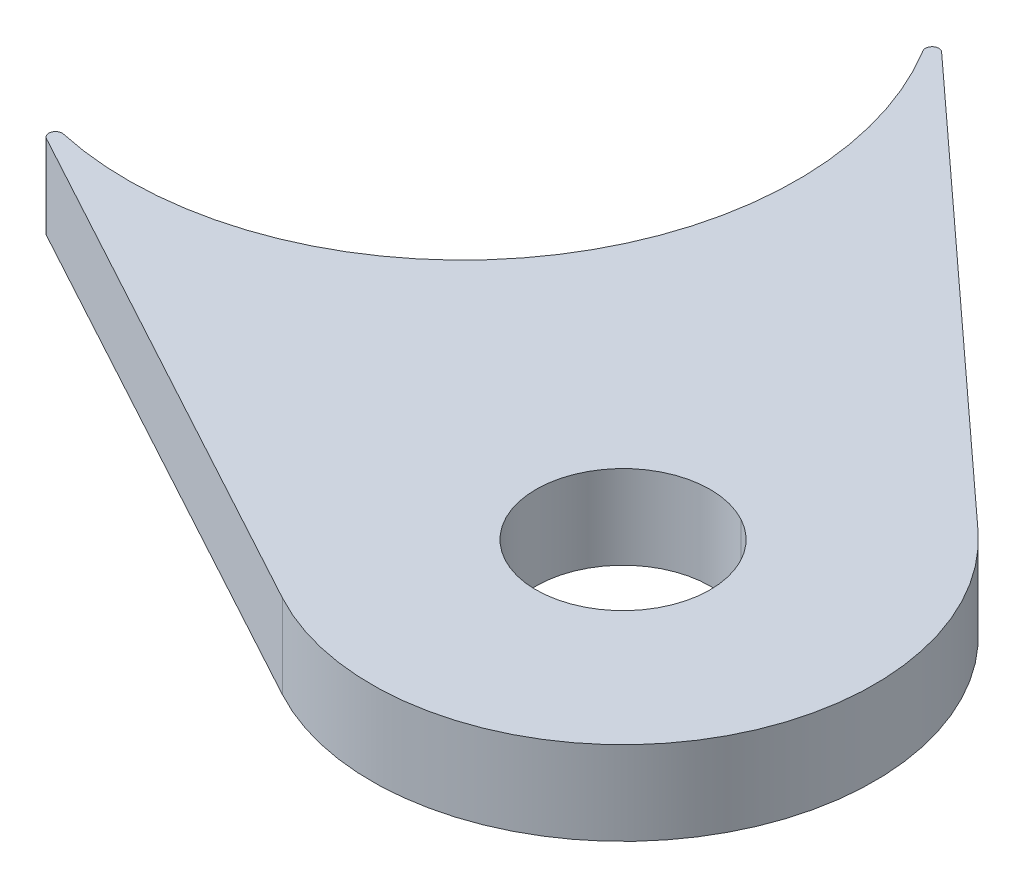
ISO-10303-21;
HEADER;
FILE_DESCRIPTION(('STEP AP214'),'2;1');
FILE_NAME('part.step','',(''),(''),'','','');
FILE_SCHEMA(('AUTOMOTIVE_DESIGN { 1 0 10303 214 1 1 1 1 }'));
ENDSEC;
DATA;
#1=APPLICATION_CONTEXT('core data for automotive mechanical design processes');
#2=APPLICATION_PROTOCOL_DEFINITION('international standard','automotive_design',2000,#1);
#3=PRODUCT_CONTEXT('',#1,'mechanical');
#4=PRODUCT('Part','Part','',(#3));
#5=PRODUCT_RELATED_PRODUCT_CATEGORY('part','',(#4));
#6=PRODUCT_DEFINITION_FORMATION('','',#4);
#7=PRODUCT_DEFINITION_CONTEXT('part definition',#1,'design');
#8=PRODUCT_DEFINITION('design','',#6,#7);
#9=PRODUCT_DEFINITION_SHAPE('','',#8);
#10=(LENGTH_UNIT() NAMED_UNIT(*) SI_UNIT(.MILLI.,.METRE.));
#11=(NAMED_UNIT(*) PLANE_ANGLE_UNIT() SI_UNIT($,.RADIAN.));
#12=(NAMED_UNIT(*) SI_UNIT($,.STERADIAN.) SOLID_ANGLE_UNIT());
#13=UNCERTAINTY_MEASURE_WITH_UNIT(LENGTH_MEASURE(1.E-05),#10,'distance_accuracy_value','');
#14=(GEOMETRIC_REPRESENTATION_CONTEXT(3) GLOBAL_UNCERTAINTY_ASSIGNED_CONTEXT((#13)) GLOBAL_UNIT_ASSIGNED_CONTEXT((#10,
#11,#12)) REPRESENTATION_CONTEXT('',''));
#15=CARTESIAN_POINT('',(0.,0.,0.));
#16=DIRECTION('',(0.,0.,1.));
#17=DIRECTION('',(1.,0.,0.));
#18=AXIS2_PLACEMENT_3D('',#15,#16,#17);
#19=CARTESIAN_POINT('',(21.2002725978992,3.175,15.1119048029944));
#20=DIRECTION('',(0.,-1.,0.));
#21=DIRECTION('',(0.,0.,-1.));
#22=AXIS2_PLACEMENT_3D('',#19,#20,#21);
#23=CYLINDRICAL_SURFACE('',#22,3.29999999999998);
#24=CARTESIAN_POINT('',(21.2002725978992,3.175,15.1119048029944));
#25=DIRECTION('',(0.,1.,0.));
#26=DIRECTION('',(0.,0.,1.));
#27=AXIS2_PLACEMENT_3D('',#24,#25,#26);
#28=CIRCLE('',#27,3.29999999999998);
#29=CARTESIAN_POINT('',(22.7737409759033,3.175,12.2111812271566));
#30=VERTEX_POINT('',#29);
#31=CARTESIAN_POINT('',(19.6268042198951,3.175,18.0126283788321));
#32=VERTEX_POINT('',#31);
#33=EDGE_CURVE('E156',#30,#32,#28,.T.);
#34=ORIENTED_EDGE('',*,*,#33,.T.);
#35=DIRECTION('',(0.,-1.,0.));
#36=VECTOR('',#35,1.);
#37=CARTESIAN_POINT('',(19.6268042198951,3.175,18.0126283788321));
#38=LINE('',#37,#36);
#39=CARTESIAN_POINT('',(19.6268042198951,0.,18.0126283788321));
#40=VERTEX_POINT('',#39);
#41=EDGE_CURVE('E11',#32,#40,#38,.T.);
#42=ORIENTED_EDGE('',*,*,#41,.T.);
#43=CARTESIAN_POINT('',(21.2002725978992,0.,15.1119048029944));
#44=DIRECTION('',(0.,1.,0.));
#45=DIRECTION('',(0.,0.,1.));
#46=AXIS2_PLACEMENT_3D('',#43,#44,#45);
#47=CIRCLE('',#46,3.29999999999998);
#48=CARTESIAN_POINT('',(22.7737409759033,0.,12.2111812271566));
#49=VERTEX_POINT('',#48);
#50=EDGE_CURVE('E158',#49,#40,#47,.T.);
#51=ORIENTED_EDGE('',*,*,#50,.F.);
#52=DIRECTION('',(0.,1.,0.));
#53=VECTOR('',#52,1.);
#54=CARTESIAN_POINT('',(22.7737409759033,3.175,12.2111812271566));
#55=LINE('',#54,#53);
#56=EDGE_CURVE('E48',#49,#30,#55,.T.);
#57=ORIENTED_EDGE('',*,*,#56,.T.);
#58=EDGE_LOOP('',(#34,#42,#51,#57));
#59=FACE_BOUND('',#58,.T.);
#60=ADVANCED_FACE('F39',(#59),#23,.F.);
#61=CARTESIAN_POINT('',(21.2002725978992,3.175,15.1119048029944));
#62=DIRECTION('',(0.,-1.,0.));
#63=DIRECTION('',(0.,0.,-1.));
#64=AXIS2_PLACEMENT_3D('',#61,#62,#63);
#65=PLANE('',#64);
#66=DIRECTION('',(-0.737435012841057,0.,-0.675418094098841));
#67=VECTOR('',#66,1.);
#68=CARTESIAN_POINT('',(27.6336299441907,3.175,8.0878363056833));
#69=LINE('',#68,#67);
#70=CARTESIAN_POINT('',(27.6336299441907,3.175,8.0878363056833));
#71=VERTEX_POINT('',#70);
#72=CARTESIAN_POINT('',(11.2267519102379,3.175,-6.93925367355661));
#73=VERTEX_POINT('',#72);
#74=EDGE_CURVE('E102',#71,#73,#69,.T.);
#75=ORIENTED_EDGE('',*,*,#74,.T.);
#76=CARTESIAN_POINT('',(11.0551957143368,3.175,-6.75194518029498));
#77=DIRECTION('',(0.,-1.,0.));
#78=DIRECTION('',(0.,0.,-1.));
#79=AXIS2_PLACEMENT_3D('',#76,#77,#78);
#80=CIRCLE('',#79,0.254);
#81=CARTESIAN_POINT('',(10.8384271709185,3.175,-6.61955409832841));
#82=VERTEX_POINT('',#81);
#83=EDGE_CURVE('E146',#73,#82,#80,.F.);
#84=ORIENTED_EDGE('',*,*,#83,.T.);
#85=CARTESIAN_POINT('',(0.,3.175,0.));
#86=DIRECTION('',(0.,-1.,0.));
#87=DIRECTION('',(0.,0.,1.));
#88=AXIS2_PLACEMENT_3D('',#85,#86,#87);
#89=CIRCLE('',#88,12.7);
#90=CARTESIAN_POINT('',(-2.72242756199068,3.175,12.4047727979884));
#91=VERTEX_POINT('',#90);
#92=EDGE_CURVE('E113',#82,#91,#89,.T.);
#93=ORIENTED_EDGE('',*,*,#92,.T.);
#94=CARTESIAN_POINT('',(-2.7768761132305,3.175,12.6528682539482));
#95=DIRECTION('',(0.,-1.,0.));
#96=DIRECTION('',(0.,0.,-1.));
#97=AXIS2_PLACEMENT_3D('',#94,#95,#96);
#98=CIRCLE('',#97,0.254);
#99=CARTESIAN_POINT('',(-2.89798549747688,3.175,12.8761360685733));
#100=VERTEX_POINT('',#99);
#101=EDGE_CURVE('E144',#91,#100,#98,.F.);
#102=ORIENTED_EDGE('',*,*,#101,.T.);
#103=DIRECTION('',(0.879007144193264,0.,0.47680859939519));
#104=VECTOR('',#103,1.);
#105=CARTESIAN_POINT('',(16.65867068866,3.175,23.4844478514352));
#106=LINE('',#105,#104);
#107=CARTESIAN_POINT('',(16.65867068866,3.175,23.4844478514352));
#108=VERTEX_POINT('',#107);
#109=EDGE_CURVE('E120',#100,#108,#106,.T.);
#110=ORIENTED_EDGE('',*,*,#109,.T.);
#111=CARTESIAN_POINT('',(21.2002725978992,3.175,15.1119048029944));
#112=DIRECTION('',(0.,1.,0.));
#113=DIRECTION('',(0.,0.,-1.));
#114=AXIS2_PLACEMENT_3D('',#111,#112,#113);
#115=CIRCLE('',#114,9.525);
#116=EDGE_CURVE('E114',#108,#71,#115,.T.);
#117=ORIENTED_EDGE('',*,*,#116,.T.);
#118=EDGE_LOOP('',(#75,#84,#93,#102,#110,#117));
#119=FACE_BOUND('',#118,.T.);
#120=ORIENTED_EDGE('',*,*,#33,.F.);
#121=EDGE_CURVE('E159',#32,#30,#28,.T.);
#122=ORIENTED_EDGE('',*,*,#121,.F.);
#123=EDGE_LOOP('',(#120,#122));
#124=FACE_BOUND('',#123,.T.);
#125=ADVANCED_FACE('F117',(#119,#124),#65,.F.);
#126=CARTESIAN_POINT('',(21.2002725978992,0.,15.1119048029944));
#127=DIRECTION('',(0.,-1.,0.));
#128=DIRECTION('',(0.,0.,-1.));
#129=AXIS2_PLACEMENT_3D('',#126,#127,#128);
#130=PLANE('',#129);
#131=CARTESIAN_POINT('',(0.,0.,0.));
#132=DIRECTION('',(0.,-1.,0.));
#133=DIRECTION('',(0.,0.,1.));
#134=AXIS2_PLACEMENT_3D('',#131,#132,#133);
#135=CIRCLE('',#134,12.7);
#136=CARTESIAN_POINT('',(10.8384271709185,0.,-6.61955409832841));
#137=VERTEX_POINT('',#136);
#138=CARTESIAN_POINT('',(-2.72242756199068,0.,12.4047727979884));
#139=VERTEX_POINT('',#138);
#140=EDGE_CURVE('E170',#137,#139,#135,.T.);
#141=ORIENTED_EDGE('',*,*,#140,.F.);
#142=CARTESIAN_POINT('',(11.0551957143368,0.,-6.75194518029498));
#143=DIRECTION('',(0.,-1.,0.));
#144=DIRECTION('',(0.,0.,-1.));
#145=AXIS2_PLACEMENT_3D('',#142,#143,#144);
#146=CIRCLE('',#145,0.254);
#147=CARTESIAN_POINT('',(11.2267519102379,0.,-6.93925367355661));
#148=VERTEX_POINT('',#147);
#149=EDGE_CURVE('E141',#137,#148,#146,.T.);
#150=ORIENTED_EDGE('',*,*,#149,.T.);
#151=DIRECTION('',(-0.737435012841057,0.,-0.675418094098841));
#152=VECTOR('',#151,1.);
#153=CARTESIAN_POINT('',(27.6336299441907,0.,8.0878363056833));
#154=LINE('',#153,#152);
#155=CARTESIAN_POINT('',(27.6336299441907,0.,8.0878363056833));
#156=VERTEX_POINT('',#155);
#157=EDGE_CURVE('E161',#156,#148,#154,.T.);
#158=ORIENTED_EDGE('',*,*,#157,.F.);
#159=CARTESIAN_POINT('',(21.2002725978992,0.,15.1119048029944));
#160=DIRECTION('',(0.,1.,0.));
#161=DIRECTION('',(0.,0.,-1.));
#162=AXIS2_PLACEMENT_3D('',#159,#160,#161);
#163=CIRCLE('',#162,9.525);
#164=CARTESIAN_POINT('',(16.65867068866,0.,23.4844478514352));
#165=VERTEX_POINT('',#164);
#166=EDGE_CURVE('E128',#165,#156,#163,.T.);
#167=ORIENTED_EDGE('',*,*,#166,.F.);
#168=DIRECTION('',(0.879007144193264,0.,0.47680859939519));
#169=VECTOR('',#168,1.);
#170=CARTESIAN_POINT('',(16.65867068866,0.,23.4844478514352));
#171=LINE('',#170,#169);
#172=CARTESIAN_POINT('',(-2.89798549747688,0.,12.8761360685733));
#173=VERTEX_POINT('',#172);
#174=EDGE_CURVE('E124',#173,#165,#171,.T.);
#175=ORIENTED_EDGE('',*,*,#174,.F.);
#176=CARTESIAN_POINT('',(-2.7768761132305,0.,12.6528682539482));
#177=DIRECTION('',(0.,-1.,0.));
#178=DIRECTION('',(0.,0.,-1.));
#179=AXIS2_PLACEMENT_3D('',#176,#177,#178);
#180=CIRCLE('',#179,0.254);
#181=EDGE_CURVE('E139',#173,#139,#180,.T.);
#182=ORIENTED_EDGE('',*,*,#181,.T.);
#183=EDGE_LOOP('',(#141,#150,#158,#167,#175,#182));
#184=FACE_BOUND('',#183,.T.);
#185=ORIENTED_EDGE('',*,*,#50,.T.);
#186=EDGE_CURVE('E164',#40,#49,#47,.T.);
#187=ORIENTED_EDGE('',*,*,#186,.T.);
#188=EDGE_LOOP('',(#185,#187));
#189=FACE_BOUND('',#188,.T.);
#190=ADVANCED_FACE('F178',(#184,#189),#130,.T.);
#191=CARTESIAN_POINT('',(21.2002725978992,3.175,15.1119048029944));
#192=DIRECTION('',(0.,-1.,0.));
#193=DIRECTION('',(0.,0.,-1.));
#194=AXIS2_PLACEMENT_3D('',#191,#192,#193);
#195=CYLINDRICAL_SURFACE('',#194,9.525);
#196=ORIENTED_EDGE('',*,*,#166,.T.);
#197=DIRECTION('',(0.,-1.,0.));
#198=VECTOR('',#197,1.);
#199=CARTESIAN_POINT('',(27.6336299441907,3.175,8.0878363056833));
#200=LINE('',#199,#198);
#201=EDGE_CURVE('E107',#71,#156,#200,.T.);
#202=ORIENTED_EDGE('',*,*,#201,.F.);
#203=ORIENTED_EDGE('',*,*,#116,.F.);
#204=DIRECTION('',(0.,-1.,0.));
#205=VECTOR('',#204,1.);
#206=CARTESIAN_POINT('',(16.65867068866,3.175,23.4844478514352));
#207=LINE('',#206,#205);
#208=EDGE_CURVE('E130',#108,#165,#207,.T.);
#209=ORIENTED_EDGE('',*,*,#208,.T.);
#210=EDGE_LOOP('',(#196,#202,#203,#209));
#211=FACE_BOUND('',#210,.T.);
#212=ADVANCED_FACE('F126',(#211),#195,.T.);
#213=CARTESIAN_POINT('',(27.6336299441907,3.175,8.0878363056833));
#214=DIRECTION('',(-0.675418094098841,0.,0.737435012841057));
#215=DIRECTION('',(0.737435012841057,0.,0.675418094098841));
#216=AXIS2_PLACEMENT_3D('',#213,#214,#215);
#217=PLANE('',#216);
#218=ORIENTED_EDGE('',*,*,#157,.T.);
#219=DIRECTION('',(0.,-1.,0.));
#220=VECTOR('',#219,1.);
#221=CARTESIAN_POINT('',(11.2267519102379,3.175,-6.93925367355661));
#222=LINE('',#221,#220);
#223=EDGE_CURVE('E110',#148,#73,#222,.F.);
#224=ORIENTED_EDGE('',*,*,#223,.T.);
#225=ORIENTED_EDGE('',*,*,#74,.F.);
#226=ORIENTED_EDGE('',*,*,#201,.T.);
#227=EDGE_LOOP('',(#218,#224,#225,#226));
#228=FACE_BOUND('',#227,.T.);
#229=ADVANCED_FACE('F105',(#228),#217,.F.);
#230=CARTESIAN_POINT('',(0.,3.175,0.));
#231=DIRECTION('',(0.,-1.,0.));
#232=DIRECTION('',(0.,0.,-1.));
#233=AXIS2_PLACEMENT_3D('',#230,#231,#232);
#234=CYLINDRICAL_SURFACE('',#233,12.7);
#235=ORIENTED_EDGE('',*,*,#92,.F.);
#236=DIRECTION('',(0.,-1.,0.));
#237=VECTOR('',#236,1.);
#238=CARTESIAN_POINT('',(10.8384271709185,3.175,-6.61955409832841));
#239=LINE('',#238,#237);
#240=EDGE_CURVE('E132',#82,#137,#239,.T.);
#241=ORIENTED_EDGE('',*,*,#240,.T.);
#242=ORIENTED_EDGE('',*,*,#140,.T.);
#243=DIRECTION('',(0.,-1.,0.));
#244=VECTOR('',#243,1.);
#245=CARTESIAN_POINT('',(-2.72242756199068,3.175,12.4047727979884));
#246=LINE('',#245,#244);
#247=EDGE_CURVE('E129',#139,#91,#246,.F.);
#248=ORIENTED_EDGE('',*,*,#247,.T.);
#249=EDGE_LOOP('',(#235,#241,#242,#248));
#250=FACE_BOUND('',#249,.T.);
#251=ADVANCED_FACE('F186',(#250),#234,.F.);
#252=CARTESIAN_POINT('',(16.65867068866,3.175,23.4844478514352));
#253=DIRECTION('',(0.47680859939519,0.,-0.879007144193264));
#254=DIRECTION('',(-0.879007144193264,0.,-0.47680859939519));
#255=AXIS2_PLACEMENT_3D('',#252,#253,#254);
#256=PLANE('',#255);
#257=ORIENTED_EDGE('',*,*,#109,.F.);
#258=DIRECTION('',(0.,-1.,0.));
#259=VECTOR('',#258,1.);
#260=CARTESIAN_POINT('',(-2.89798549747688,3.175,12.8761360685733));
#261=LINE('',#260,#259);
#262=EDGE_CURVE('E148',#100,#173,#261,.T.);
#263=ORIENTED_EDGE('',*,*,#262,.T.);
#264=ORIENTED_EDGE('',*,*,#174,.T.);
#265=ORIENTED_EDGE('',*,*,#208,.F.);
#266=EDGE_LOOP('',(#257,#263,#264,#265));
#267=FACE_BOUND('',#266,.T.);
#268=ADVANCED_FACE('F174',(#267),#256,.F.);
#269=ORIENTED_EDGE('',*,*,#41,.F.);
#270=ORIENTED_EDGE('',*,*,#121,.T.);
#271=ORIENTED_EDGE('',*,*,#56,.F.);
#272=ORIENTED_EDGE('',*,*,#186,.F.);
#273=EDGE_LOOP('',(#269,#270,#271,#272));
#274=FACE_BOUND('',#273,.T.);
#275=ADVANCED_FACE('F193',(#274),#23,.F.);
#276=CARTESIAN_POINT('',(11.0551957143368,3.175,-6.75194518029498));
#277=DIRECTION('',(0.,-1.,0.));
#278=DIRECTION('',(0.,0.,-1.));
#279=AXIS2_PLACEMENT_3D('',#276,#277,#278);
#280=CYLINDRICAL_SURFACE('',#279,0.254);
#281=ORIENTED_EDGE('',*,*,#83,.F.);
#282=ORIENTED_EDGE('',*,*,#223,.F.);
#283=ORIENTED_EDGE('',*,*,#149,.F.);
#284=ORIENTED_EDGE('',*,*,#240,.F.);
#285=EDGE_LOOP('',(#281,#282,#283,#284));
#286=FACE_BOUND('',#285,.T.);
#287=ADVANCED_FACE('F181',(#286),#280,.T.);
#288=CARTESIAN_POINT('',(-2.7768761132305,3.175,12.6528682539482));
#289=DIRECTION('',(0.,-1.,0.));
#290=DIRECTION('',(0.,0.,-1.));
#291=AXIS2_PLACEMENT_3D('',#288,#289,#290);
#292=CYLINDRICAL_SURFACE('',#291,0.254);
#293=ORIENTED_EDGE('',*,*,#101,.F.);
#294=ORIENTED_EDGE('',*,*,#247,.F.);
#295=ORIENTED_EDGE('',*,*,#181,.F.);
#296=ORIENTED_EDGE('',*,*,#262,.F.);
#297=EDGE_LOOP('',(#293,#294,#295,#296));
#298=FACE_BOUND('',#297,.T.);
#299=ADVANCED_FACE('F41',(#298),#292,.T.);
#300=CLOSED_SHELL('',(#60,#125,#190,#212,#229,#251,#268,#275,#287,#299));
#301=MANIFOLD_SOLID_BREP('B2',#300);
#302=ADVANCED_BREP_SHAPE_REPRESENTATION('',(#18,#301),#14);
#303=SHAPE_DEFINITION_REPRESENTATION(#9,#302);
ENDSEC;
END-ISO-10303-21;
